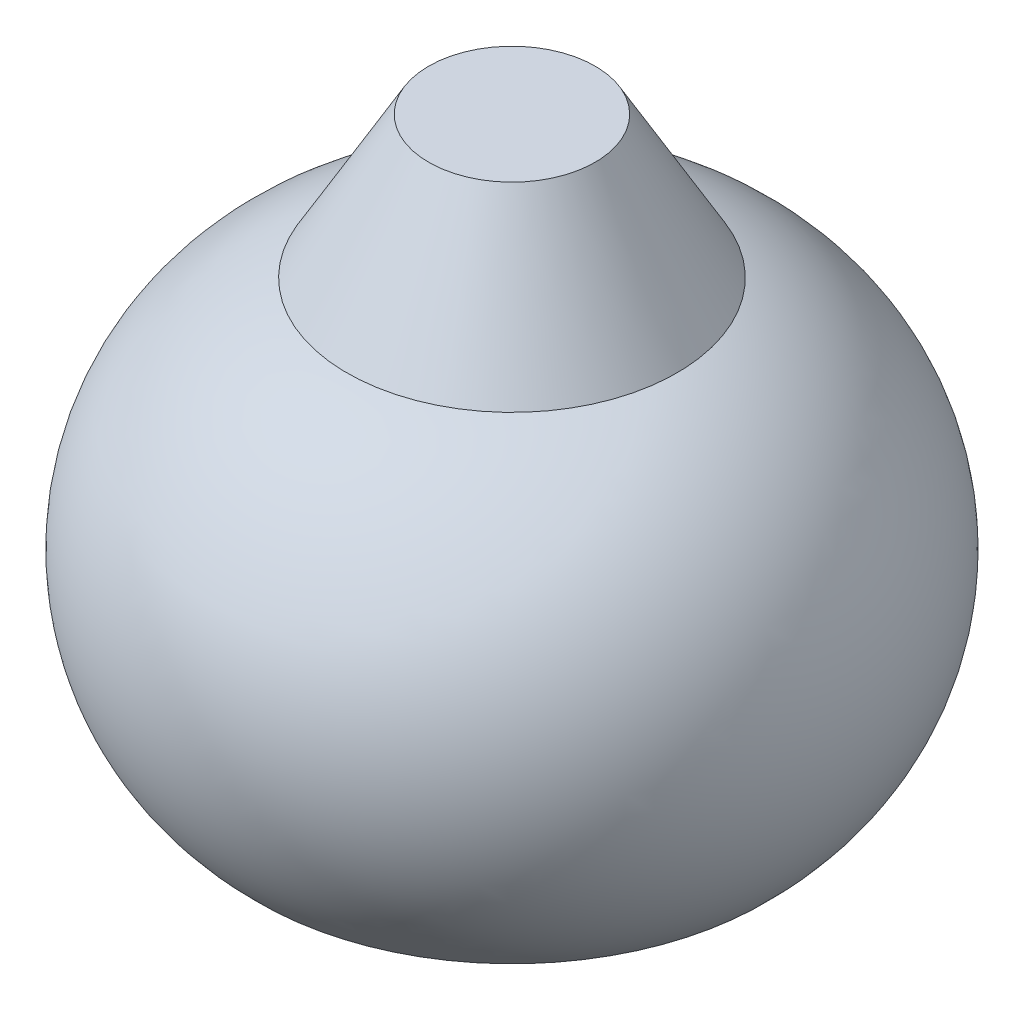
ISO-10303-21;
HEADER;
FILE_DESCRIPTION(('STEP AP214'),'2;1');
FILE_NAME('part.step','',(''),(''),'','','');
FILE_SCHEMA(('AUTOMOTIVE_DESIGN { 1 0 10303 214 1 1 1 1 }'));
ENDSEC;
DATA;
#1=APPLICATION_CONTEXT('core data for automotive mechanical design processes');
#2=APPLICATION_PROTOCOL_DEFINITION('international standard','automotive_design',2000,#1);
#3=PRODUCT_CONTEXT('',#1,'mechanical');
#4=PRODUCT('Part','Part','',(#3));
#5=PRODUCT_RELATED_PRODUCT_CATEGORY('part','',(#4));
#6=PRODUCT_DEFINITION_FORMATION('','',#4);
#7=PRODUCT_DEFINITION_CONTEXT('part definition',#1,'design');
#8=PRODUCT_DEFINITION('design','',#6,#7);
#9=PRODUCT_DEFINITION_SHAPE('','',#8);
#10=(LENGTH_UNIT() NAMED_UNIT(*) SI_UNIT(.MILLI.,.METRE.));
#11=(NAMED_UNIT(*) PLANE_ANGLE_UNIT() SI_UNIT($,.RADIAN.));
#12=(NAMED_UNIT(*) SI_UNIT($,.STERADIAN.) SOLID_ANGLE_UNIT());
#13=UNCERTAINTY_MEASURE_WITH_UNIT(LENGTH_MEASURE(1.E-05),#10,'distance_accuracy_value','');
#14=(GEOMETRIC_REPRESENTATION_CONTEXT(3) GLOBAL_UNCERTAINTY_ASSIGNED_CONTEXT((#13)) GLOBAL_UNIT_ASSIGNED_CONTEXT((#10,
#11,#12)) REPRESENTATION_CONTEXT('',''));
#15=CARTESIAN_POINT('',(0.,0.,0.));
#16=DIRECTION('',(0.,0.,1.));
#17=DIRECTION('',(1.,0.,0.));
#18=AXIS2_PLACEMENT_3D('',#15,#16,#17);
#19=CARTESIAN_POINT('',(0.,23.2197100906206,0.));
#20=DIRECTION('',(0.,1.,0.));
#21=DIRECTION('',(-1.,0.,0.));
#22=AXIS2_PLACEMENT_3D('',#19,#20,#21);
#23=PLANE('',#22);
#24=CARTESIAN_POINT('',(0.,23.2197100906206,0.));
#25=DIRECTION('',(0.,1.,0.));
#26=DIRECTION('',(-1.,0.,0.));
#27=AXIS2_PLACEMENT_3D('',#24,#25,#26);
#28=CIRCLE('',#27,10.);
#29=CARTESIAN_POINT('',(-10.,23.2197100906206,0.));
#30=VERTEX_POINT('',#29);
#31=EDGE_CURVE('E10',#30,#30,#28,.T.);
#32=ORIENTED_EDGE('',*,*,#31,.T.);
#33=EDGE_LOOP('',(#32));
#34=FACE_BOUND('',#33,.T.);
#35=ADVANCED_FACE('F38',(#34),#23,.T.);
#36=CARTESIAN_POINT('',(0.,23.2197100906206,0.));
#37=DIRECTION('',(0.,-1.,0.));
#38=DIRECTION('',(1.,0.,0.));
#39=AXIS2_PLACEMENT_3D('',#36,#37,#38);
#40=CONICAL_SURFACE('',#39,10.,0.523598775598297);
#41=CARTESIAN_POINT('',(0.,6.21971009062057,0.));
#42=DIRECTION('',(0.,1.,0.));
#43=DIRECTION('',(-1.,0.,0.));
#44=AXIS2_PLACEMENT_3D('',#41,#42,#43);
#45=CIRCLE('',#44,19.8149545762236);
#46=CARTESIAN_POINT('',(-19.8149545762236,6.21971009062057,0.));
#47=VERTEX_POINT('',#46);
#48=EDGE_CURVE('E44',#47,#47,#45,.T.);
#49=ORIENTED_EDGE('',*,*,#48,.T.);
#50=EDGE_LOOP('',(#49));
#51=FACE_BOUND('',#50,.T.);
#52=ORIENTED_EDGE('',*,*,#31,.F.);
#53=EDGE_LOOP('',(#52));
#54=FACE_BOUND('',#53,.T.);
#55=ADVANCED_FACE('F76',(#51,#54),#40,.T.);
#56=CARTESIAN_POINT('',(0.,-21.9820532495359,0.));
#57=DIRECTION('',(0.,1.,0.));
#58=DIRECTION('',(-1.,0.,0.));
#59=AXIS2_PLACEMENT_3D('',#56,#57,#58);
#60=DEGENERATE_TOROIDAL_SURFACE('',#59,9.58458095128669,30.,.T.);
#61=CARTESIAN_POINT('',(0.,-43.7802899093795,0.));
#62=DIRECTION('',(0.,1.,0.));
#63=DIRECTION('',(-1.,0.,0.));
#64=AXIS2_PLACEMENT_3D('',#61,#62,#63);
#65=CIRCLE('',#64,30.1961524227066);
#66=CARTESIAN_POINT('',(-30.1961524227066,-43.7802899093795,0.));
#67=VERTEX_POINT('',#66);
#68=EDGE_CURVE('E48',#67,#67,#65,.T.);
#69=ORIENTED_EDGE('',*,*,#68,.T.);
#70=EDGE_LOOP('',(#69));
#71=FACE_BOUND('',#70,.T.);
#72=ORIENTED_EDGE('',*,*,#48,.F.);
#73=EDGE_LOOP('',(#72));
#74=FACE_BOUND('',#73,.T.);
#75=ADVANCED_FACE('F80',(#71,#74),#60,.T.);
#76=CARTESIAN_POINT('',(0.,-43.7802899093795,0.));
#77=DIRECTION('',(0.,1.,0.));
#78=DIRECTION('',(-1.,0.,0.));
#79=AXIS2_PLACEMENT_3D('',#76,#77,#78);
#80=CONICAL_SURFACE('',#79,30.1961524227066,1.0471975511966);
#81=CARTESIAN_POINT('',(0.,-46.7802899093794,0.));
#82=DIRECTION('',(0.,1.,0.));
#83=DIRECTION('',(-1.,0.,0.));
#84=AXIS2_PLACEMENT_3D('',#81,#82,#83);
#85=CIRCLE('',#84,25.);
#86=CARTESIAN_POINT('',(-25.,-46.7802899093794,0.));
#87=VERTEX_POINT('',#86);
#88=EDGE_CURVE('E52',#87,#87,#85,.T.);
#89=ORIENTED_EDGE('',*,*,#88,.T.);
#90=EDGE_LOOP('',(#89));
#91=FACE_BOUND('',#90,.T.);
#92=ORIENTED_EDGE('',*,*,#68,.F.);
#93=EDGE_LOOP('',(#92));
#94=FACE_BOUND('',#93,.T.);
#95=ADVANCED_FACE('F84',(#91,#94),#80,.T.);
#96=CARTESIAN_POINT('',(-25.,-46.7802899093794,0.));
#97=DIRECTION('',(0.,-1.,0.));
#98=DIRECTION('',(1.,0.,0.));
#99=AXIS2_PLACEMENT_3D('',#96,#97,#98);
#100=PLANE('',#99);
#101=CARTESIAN_POINT('',(0.,-46.7802899093794,0.));
#102=DIRECTION('',(0.,1.,0.));
#103=DIRECTION('',(-1.,0.,0.));
#104=AXIS2_PLACEMENT_3D('',#101,#102,#103);
#105=CIRCLE('',#104,19.8149545762236);
#106=CARTESIAN_POINT('',(-19.8149545762236,-46.7802899093794,0.));
#107=VERTEX_POINT('',#106);
#108=EDGE_CURVE('E57',#107,#107,#105,.T.);
#109=ORIENTED_EDGE('',*,*,#108,.T.);
#110=EDGE_LOOP('',(#109));
#111=FACE_BOUND('',#110,.T.);
#112=ORIENTED_EDGE('',*,*,#88,.F.);
#113=EDGE_LOOP('',(#112));
#114=FACE_BOUND('',#113,.T.);
#115=ADVANCED_FACE('F73',(#111,#114),#100,.T.);
#116=CARTESIAN_POINT('',(0.,23.2197100906206,0.));
#117=DIRECTION('',(0.,1.,0.));
#118=DIRECTION('',(-1.,0.,0.));
#119=AXIS2_PLACEMENT_3D('',#116,#117,#118);
#120=CYLINDRICAL_SURFACE('',#119,19.8149545762236);
#121=CARTESIAN_POINT('',(0.,-23.2197100906206,0.));
#122=DIRECTION('',(0.,1.,0.));
#123=DIRECTION('',(-1.,0.,0.));
#124=AXIS2_PLACEMENT_3D('',#121,#122,#123);
#125=CIRCLE('',#124,19.8149545762236);
#126=CARTESIAN_POINT('',(-19.8149545762236,-23.2197100906206,0.));
#127=VERTEX_POINT('',#126);
#128=EDGE_CURVE('E60',#127,#127,#125,.T.);
#129=ORIENTED_EDGE('',*,*,#128,.T.);
#130=EDGE_LOOP('',(#129));
#131=FACE_BOUND('',#130,.T.);
#132=ORIENTED_EDGE('',*,*,#108,.F.);
#133=EDGE_LOOP('',(#132));
#134=FACE_BOUND('',#133,.T.);
#135=ADVANCED_FACE('F64',(#131,#134),#120,.F.);
#136=CARTESIAN_POINT('',(0.,-23.2197100906206,0.));
#137=DIRECTION('',(0.,-1.,0.));
#138=DIRECTION('',(1.,0.,0.));
#139=AXIS2_PLACEMENT_3D('',#136,#137,#138);
#140=PLANE('',#139);
#141=ORIENTED_EDGE('',*,*,#128,.F.);
#142=EDGE_LOOP('',(#141));
#143=FACE_BOUND('',#142,.T.);
#144=ADVANCED_FACE('F67',(#143),#140,.T.);
#145=CLOSED_SHELL('',(#35,#55,#75,#95,#115,#135,#144));
#146=MANIFOLD_SOLID_BREP('B2',#145);
#147=ADVANCED_BREP_SHAPE_REPRESENTATION('',(#18,#146),#14);
#148=SHAPE_DEFINITION_REPRESENTATION(#9,#147);
ENDSEC;
END-ISO-10303-21;
